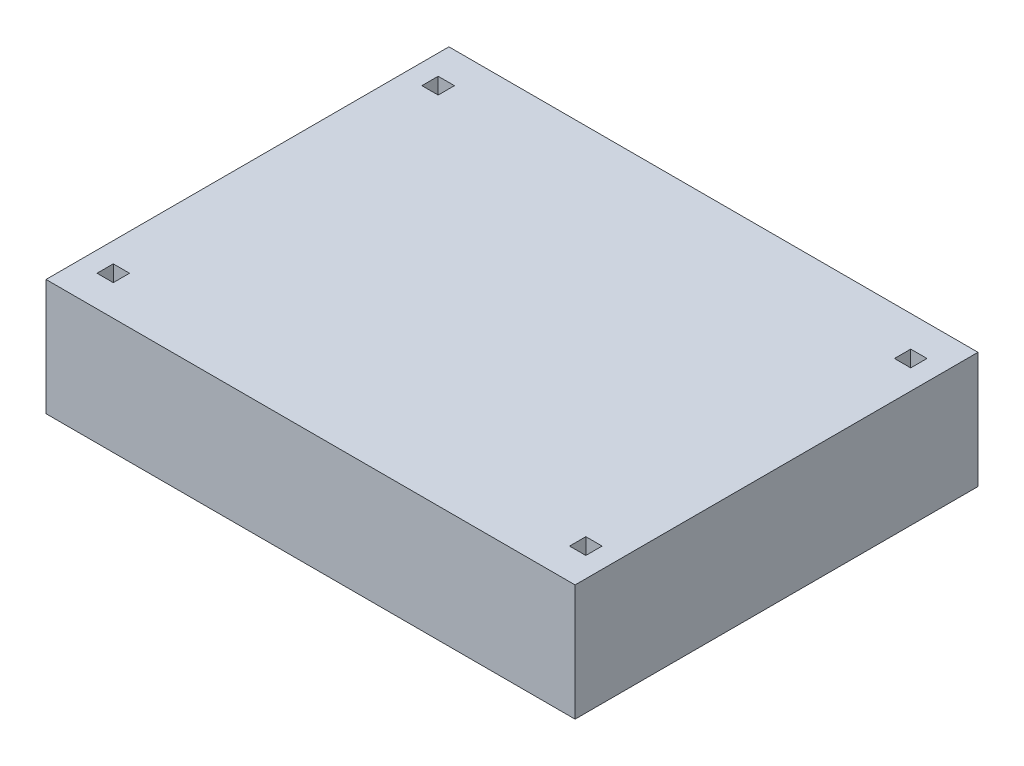
ISO-10303-21;
HEADER;
FILE_DESCRIPTION(('STEP AP214'),'2;1');
FILE_NAME('part.step','',(''),(''),'','','');
FILE_SCHEMA(('AUTOMOTIVE_DESIGN { 1 0 10303 214 1 1 1 1 }'));
ENDSEC;
DATA;
#1=APPLICATION_CONTEXT('core data for automotive mechanical design processes');
#2=APPLICATION_PROTOCOL_DEFINITION('international standard','automotive_design',2000,#1);
#3=PRODUCT_CONTEXT('',#1,'mechanical');
#4=PRODUCT('Part','Part','',(#3));
#5=PRODUCT_RELATED_PRODUCT_CATEGORY('part','',(#4));
#6=PRODUCT_DEFINITION_FORMATION('','',#4);
#7=PRODUCT_DEFINITION_CONTEXT('part definition',#1,'design');
#8=PRODUCT_DEFINITION('design','',#6,#7);
#9=PRODUCT_DEFINITION_SHAPE('','',#8);
#10=(LENGTH_UNIT() NAMED_UNIT(*) SI_UNIT(.MILLI.,.METRE.));
#11=(NAMED_UNIT(*) PLANE_ANGLE_UNIT() SI_UNIT($,.RADIAN.));
#12=(NAMED_UNIT(*) SI_UNIT($,.STERADIAN.) SOLID_ANGLE_UNIT());
#13=UNCERTAINTY_MEASURE_WITH_UNIT(LENGTH_MEASURE(1.E-05),#10,'distance_accuracy_value','');
#14=(GEOMETRIC_REPRESENTATION_CONTEXT(3) GLOBAL_UNCERTAINTY_ASSIGNED_CONTEXT((#13)) GLOBAL_UNIT_ASSIGNED_CONTEXT((#10,
#11,#12)) REPRESENTATION_CONTEXT('',''));
#15=CARTESIAN_POINT('',(0.,0.,0.));
#16=DIRECTION('',(0.,0.,1.));
#17=DIRECTION('',(1.,0.,0.));
#18=AXIS2_PLACEMENT_3D('',#15,#16,#17);
#19=CARTESIAN_POINT('',(-22.75,10.,17.325));
#20=DIRECTION('',(1.,0.,0.));
#21=DIRECTION('',(0.,0.,-1.));
#22=AXIS2_PLACEMENT_3D('',#19,#20,#21);
#23=PLANE('',#22);
#24=DIRECTION('',(0.,0.,1.));
#25=VECTOR('',#24,1.);
#26=CARTESIAN_POINT('',(-22.75,0.,17.325));
#27=LINE('',#26,#25);
#28=CARTESIAN_POINT('',(-22.75,0.,-17.325));
#29=VERTEX_POINT('',#28);
#30=CARTESIAN_POINT('',(-22.75,0.,17.325));
#31=VERTEX_POINT('',#30);
#32=EDGE_CURVE('E294',#29,#31,#27,.T.);
#33=ORIENTED_EDGE('',*,*,#32,.T.);
#34=DIRECTION('',(0.,-1.,0.));
#35=VECTOR('',#34,1.);
#36=CARTESIAN_POINT('',(-22.75,10.,17.325));
#37=LINE('',#36,#35);
#38=CARTESIAN_POINT('',(-22.75,10.,17.325));
#39=VERTEX_POINT('',#38);
#40=EDGE_CURVE('E11',#39,#31,#37,.T.);
#41=ORIENTED_EDGE('',*,*,#40,.F.);
#42=DIRECTION('',(0.,0.,1.));
#43=VECTOR('',#42,1.);
#44=CARTESIAN_POINT('',(-22.75,10.,17.325));
#45=LINE('',#44,#43);
#46=CARTESIAN_POINT('',(-22.75,10.,-17.325));
#47=VERTEX_POINT('',#46);
#48=EDGE_CURVE('E301',#47,#39,#45,.T.);
#49=ORIENTED_EDGE('',*,*,#48,.F.);
#50=DIRECTION('',(0.,-1.,0.));
#51=VECTOR('',#50,1.);
#52=CARTESIAN_POINT('',(-22.75,10.,-17.325));
#53=LINE('',#52,#51);
#54=EDGE_CURVE('E311',#47,#29,#53,.T.);
#55=ORIENTED_EDGE('',*,*,#54,.T.);
#56=EDGE_LOOP('',(#33,#41,#49,#55));
#57=FACE_BOUND('',#56,.T.);
#58=ADVANCED_FACE('F32',(#57),#23,.F.);
#59=CARTESIAN_POINT('',(22.75,10.,17.325));
#60=DIRECTION('',(0.,0.,-1.));
#61=DIRECTION('',(-1.,0.,0.));
#62=AXIS2_PLACEMENT_3D('',#59,#60,#61);
#63=PLANE('',#62);
#64=DIRECTION('',(1.,0.,0.));
#65=VECTOR('',#64,1.);
#66=CARTESIAN_POINT('',(22.75,0.,17.325));
#67=LINE('',#66,#65);
#68=CARTESIAN_POINT('',(22.75,0.,17.325));
#69=VERTEX_POINT('',#68);
#70=EDGE_CURVE('E314',#31,#69,#67,.T.);
#71=ORIENTED_EDGE('',*,*,#70,.T.);
#72=DIRECTION('',(0.,-1.,0.));
#73=VECTOR('',#72,1.);
#74=CARTESIAN_POINT('',(22.75,10.,17.325));
#75=LINE('',#74,#73);
#76=CARTESIAN_POINT('',(22.75,10.,17.325));
#77=VERTEX_POINT('',#76);
#78=EDGE_CURVE('E39',#77,#69,#75,.T.);
#79=ORIENTED_EDGE('',*,*,#78,.F.);
#80=DIRECTION('',(1.,0.,0.));
#81=VECTOR('',#80,1.);
#82=CARTESIAN_POINT('',(22.75,10.,17.325));
#83=LINE('',#82,#81);
#84=EDGE_CURVE('E304',#39,#77,#83,.T.);
#85=ORIENTED_EDGE('',*,*,#84,.F.);
#86=ORIENTED_EDGE('',*,*,#40,.T.);
#87=EDGE_LOOP('',(#71,#79,#85,#86));
#88=FACE_BOUND('',#87,.T.);
#89=ADVANCED_FACE('F344',(#88),#63,.F.);
#90=CARTESIAN_POINT('',(22.75,10.,17.325));
#91=DIRECTION('',(-1.,0.,0.));
#92=DIRECTION('',(0.,0.,1.));
#93=AXIS2_PLACEMENT_3D('',#90,#91,#92);
#94=PLANE('',#93);
#95=DIRECTION('',(0.,0.,-1.));
#96=VECTOR('',#95,1.);
#97=CARTESIAN_POINT('',(22.75,0.,17.325));
#98=LINE('',#97,#96);
#99=CARTESIAN_POINT('',(22.75,0.,-17.325));
#100=VERTEX_POINT('',#99);
#101=EDGE_CURVE('E316',#69,#100,#98,.T.);
#102=ORIENTED_EDGE('',*,*,#101,.T.);
#103=DIRECTION('',(0.,-1.,0.));
#104=VECTOR('',#103,1.);
#105=CARTESIAN_POINT('',(22.75,10.,-17.325));
#106=LINE('',#105,#104);
#107=CARTESIAN_POINT('',(22.75,10.,-17.325));
#108=VERTEX_POINT('',#107);
#109=EDGE_CURVE('E321',#108,#100,#106,.T.);
#110=ORIENTED_EDGE('',*,*,#109,.F.);
#111=DIRECTION('',(0.,0.,-1.));
#112=VECTOR('',#111,1.);
#113=CARTESIAN_POINT('',(22.75,10.,17.325));
#114=LINE('',#113,#112);
#115=EDGE_CURVE('E307',#77,#108,#114,.T.);
#116=ORIENTED_EDGE('',*,*,#115,.F.);
#117=ORIENTED_EDGE('',*,*,#78,.T.);
#118=EDGE_LOOP('',(#102,#110,#116,#117));
#119=FACE_BOUND('',#118,.T.);
#120=ADVANCED_FACE('F328',(#119),#94,.F.);
#121=CARTESIAN_POINT('',(22.75,10.,-17.325));
#122=DIRECTION('',(0.,0.,1.));
#123=DIRECTION('',(1.,0.,0.));
#124=AXIS2_PLACEMENT_3D('',#121,#122,#123);
#125=PLANE('',#124);
#126=DIRECTION('',(-1.,0.,0.));
#127=VECTOR('',#126,1.);
#128=CARTESIAN_POINT('',(22.75,0.,-17.325));
#129=LINE('',#128,#127);
#130=EDGE_CURVE('E305',#100,#29,#129,.T.);
#131=ORIENTED_EDGE('',*,*,#130,.T.);
#132=ORIENTED_EDGE('',*,*,#54,.F.);
#133=DIRECTION('',(-1.,0.,0.));
#134=VECTOR('',#133,1.);
#135=CARTESIAN_POINT('',(22.75,10.,-17.325));
#136=LINE('',#135,#134);
#137=EDGE_CURVE('E309',#108,#47,#136,.T.);
#138=ORIENTED_EDGE('',*,*,#137,.F.);
#139=ORIENTED_EDGE('',*,*,#109,.T.);
#140=EDGE_LOOP('',(#131,#132,#138,#139));
#141=FACE_BOUND('',#140,.T.);
#142=ADVANCED_FACE('F337',(#141),#125,.F.);
#143=CARTESIAN_POINT('',(0.,10.,0.));
#144=DIRECTION('',(0.,1.,0.));
#145=DIRECTION('',(0.,0.,1.));
#146=AXIS2_PLACEMENT_3D('',#143,#144,#145);
#147=PLANE('',#146);
#148=DIRECTION('',(0.,0.,1.));
#149=VECTOR('',#148,1.);
#150=CARTESIAN_POINT('',(19.62,10.,14.67));
#151=LINE('',#150,#149);
#152=CARTESIAN_POINT('',(19.62,10.,13.27));
#153=VERTEX_POINT('',#152);
#154=CARTESIAN_POINT('',(19.62,10.,14.67));
#155=VERTEX_POINT('',#154);
#156=EDGE_CURVE('E46',#153,#155,#151,.T.);
#157=ORIENTED_EDGE('',*,*,#156,.F.);
#158=DIRECTION('',(-1.,0.,0.));
#159=VECTOR('',#158,1.);
#160=CARTESIAN_POINT('',(21.02,10.,13.27));
#161=LINE('',#160,#159);
#162=CARTESIAN_POINT('',(21.02,10.,13.27));
#163=VERTEX_POINT('',#162);
#164=EDGE_CURVE('E188',#163,#153,#161,.T.);
#165=ORIENTED_EDGE('',*,*,#164,.F.);
#166=DIRECTION('',(0.,0.,-1.));
#167=VECTOR('',#166,1.);
#168=CARTESIAN_POINT('',(21.02,10.,14.67));
#169=LINE('',#168,#167);
#170=CARTESIAN_POINT('',(21.02,10.,14.67));
#171=VERTEX_POINT('',#170);
#172=EDGE_CURVE('E191',#171,#163,#169,.T.);
#173=ORIENTED_EDGE('',*,*,#172,.F.);
#174=DIRECTION('',(1.,0.,0.));
#175=VECTOR('',#174,1.);
#176=CARTESIAN_POINT('',(21.02,10.,14.67));
#177=LINE('',#176,#175);
#178=EDGE_CURVE('E197',#155,#171,#177,.T.);
#179=ORIENTED_EDGE('',*,*,#178,.F.);
#180=EDGE_LOOP('',(#157,#165,#173,#179));
#181=FACE_BOUND('',#180,.T.);
#182=DIRECTION('',(0.,0.,-1.));
#183=VECTOR('',#182,1.);
#184=CARTESIAN_POINT('',(-19.62,10.,14.67));
#185=LINE('',#184,#183);
#186=CARTESIAN_POINT('',(-19.62,10.,14.67));
#187=VERTEX_POINT('',#186);
#188=CARTESIAN_POINT('',(-19.62,10.,13.27));
#189=VERTEX_POINT('',#188);
#190=EDGE_CURVE('E54',#187,#189,#185,.T.);
#191=ORIENTED_EDGE('',*,*,#190,.F.);
#192=DIRECTION('',(1.,0.,0.));
#193=VECTOR('',#192,1.);
#194=CARTESIAN_POINT('',(-21.02,10.,14.67));
#195=LINE('',#194,#193);
#196=CARTESIAN_POINT('',(-21.02,10.,14.67));
#197=VERTEX_POINT('',#196);
#198=EDGE_CURVE('E210',#197,#187,#195,.T.);
#199=ORIENTED_EDGE('',*,*,#198,.F.);
#200=DIRECTION('',(0.,0.,1.));
#201=VECTOR('',#200,1.);
#202=CARTESIAN_POINT('',(-21.02,10.,14.67));
#203=LINE('',#202,#201);
#204=CARTESIAN_POINT('',(-21.02,10.,13.27));
#205=VERTEX_POINT('',#204);
#206=EDGE_CURVE('E224',#205,#197,#203,.T.);
#207=ORIENTED_EDGE('',*,*,#206,.F.);
#208=DIRECTION('',(-1.,0.,0.));
#209=VECTOR('',#208,1.);
#210=CARTESIAN_POINT('',(-21.02,10.,13.27));
#211=LINE('',#210,#209);
#212=EDGE_CURVE('E221',#189,#205,#211,.T.);
#213=ORIENTED_EDGE('',*,*,#212,.F.);
#214=EDGE_LOOP('',(#191,#199,#207,#213));
#215=FACE_BOUND('',#214,.T.);
#216=DIRECTION('',(0.,0.,1.));
#217=VECTOR('',#216,1.);
#218=CARTESIAN_POINT('',(19.62,10.,-13.27));
#219=LINE('',#218,#217);
#220=CARTESIAN_POINT('',(19.62,10.,-14.67));
#221=VERTEX_POINT('',#220);
#222=CARTESIAN_POINT('',(19.62,10.,-13.27));
#223=VERTEX_POINT('',#222);
#224=EDGE_CURVE('E231',#221,#223,#219,.T.);
#225=ORIENTED_EDGE('',*,*,#224,.F.);
#226=DIRECTION('',(-1.,0.,0.));
#227=VECTOR('',#226,1.);
#228=CARTESIAN_POINT('',(21.02,10.,-14.67));
#229=LINE('',#228,#227);
#230=CARTESIAN_POINT('',(21.02,10.,-14.67));
#231=VERTEX_POINT('',#230);
#232=EDGE_CURVE('E241',#231,#221,#229,.T.);
#233=ORIENTED_EDGE('',*,*,#232,.F.);
#234=DIRECTION('',(0.,0.,-1.));
#235=VECTOR('',#234,1.);
#236=CARTESIAN_POINT('',(21.02,10.,-13.27));
#237=LINE('',#236,#235);
#238=CARTESIAN_POINT('',(21.02,10.,-13.27));
#239=VERTEX_POINT('',#238);
#240=EDGE_CURVE('E255',#239,#231,#237,.T.);
#241=ORIENTED_EDGE('',*,*,#240,.F.);
#242=DIRECTION('',(1.,0.,0.));
#243=VECTOR('',#242,1.);
#244=CARTESIAN_POINT('',(21.02,10.,-13.27));
#245=LINE('',#244,#243);
#246=EDGE_CURVE('E252',#223,#239,#245,.T.);
#247=ORIENTED_EDGE('',*,*,#246,.F.);
#248=EDGE_LOOP('',(#225,#233,#241,#247));
#249=FACE_BOUND('',#248,.T.);
#250=DIRECTION('',(0.,0.,-1.));
#251=VECTOR('',#250,1.);
#252=CARTESIAN_POINT('',(-19.62,10.,-14.67));
#253=LINE('',#252,#251);
#254=CARTESIAN_POINT('',(-19.62,10.,-13.27));
#255=VERTEX_POINT('',#254);
#256=CARTESIAN_POINT('',(-19.62,10.,-14.67));
#257=VERTEX_POINT('',#256);
#258=EDGE_CURVE('E262',#255,#257,#253,.T.);
#259=ORIENTED_EDGE('',*,*,#258,.F.);
#260=DIRECTION('',(1.,0.,0.));
#261=VECTOR('',#260,1.);
#262=CARTESIAN_POINT('',(-21.02,10.,-13.27));
#263=LINE('',#262,#261);
#264=CARTESIAN_POINT('',(-21.02,10.,-13.27));
#265=VERTEX_POINT('',#264);
#266=EDGE_CURVE('E273',#265,#255,#263,.T.);
#267=ORIENTED_EDGE('',*,*,#266,.F.);
#268=DIRECTION('',(0.,0.,1.));
#269=VECTOR('',#268,1.);
#270=CARTESIAN_POINT('',(-21.02,10.,-14.67));
#271=LINE('',#270,#269);
#272=CARTESIAN_POINT('',(-21.02,10.,-14.67));
#273=VERTEX_POINT('',#272);
#274=EDGE_CURVE('E287',#273,#265,#271,.T.);
#275=ORIENTED_EDGE('',*,*,#274,.F.);
#276=DIRECTION('',(-1.,0.,0.));
#277=VECTOR('',#276,1.);
#278=CARTESIAN_POINT('',(-21.02,10.,-14.67));
#279=LINE('',#278,#277);
#280=EDGE_CURVE('E284',#257,#273,#279,.T.);
#281=ORIENTED_EDGE('',*,*,#280,.F.);
#282=EDGE_LOOP('',(#259,#267,#275,#281));
#283=FACE_BOUND('',#282,.T.);
#284=ORIENTED_EDGE('',*,*,#48,.T.);
#285=ORIENTED_EDGE('',*,*,#84,.T.);
#286=ORIENTED_EDGE('',*,*,#115,.T.);
#287=ORIENTED_EDGE('',*,*,#137,.T.);
#288=EDGE_LOOP('',(#284,#285,#286,#287));
#289=FACE_BOUND('',#288,.T.);
#290=ADVANCED_FACE('F343',(#181,#215,#249,#283,#289),#147,.T.);
#291=CARTESIAN_POINT('',(0.,0.,0.));
#292=DIRECTION('',(0.,1.,0.));
#293=DIRECTION('',(0.,0.,1.));
#294=AXIS2_PLACEMENT_3D('',#291,#292,#293);
#295=PLANE('',#294);
#296=ORIENTED_EDGE('',*,*,#32,.F.);
#297=ORIENTED_EDGE('',*,*,#130,.F.);
#298=ORIENTED_EDGE('',*,*,#101,.F.);
#299=ORIENTED_EDGE('',*,*,#70,.F.);
#300=EDGE_LOOP('',(#296,#297,#298,#299));
#301=FACE_BOUND('',#300,.T.);
#302=ADVANCED_FACE('F334',(#301),#295,.F.);
#303=CARTESIAN_POINT('',(-19.62,3.5,-14.67));
#304=DIRECTION('',(1.,0.,0.));
#305=DIRECTION('',(0.,0.,-1.));
#306=AXIS2_PLACEMENT_3D('',#303,#304,#305);
#307=PLANE('',#306);
#308=ORIENTED_EDGE('',*,*,#258,.T.);
#309=DIRECTION('',(0.,1.,0.));
#310=VECTOR('',#309,1.);
#311=CARTESIAN_POINT('',(-19.62,3.5,-14.67));
#312=LINE('',#311,#310);
#313=CARTESIAN_POINT('',(-19.62,3.5,-14.67));
#314=VERTEX_POINT('',#313);
#315=EDGE_CURVE('E282',#314,#257,#312,.T.);
#316=ORIENTED_EDGE('',*,*,#315,.F.);
#317=DIRECTION('',(0.,0.,-1.));
#318=VECTOR('',#317,1.);
#319=CARTESIAN_POINT('',(-19.62,3.5,-14.67));
#320=LINE('',#319,#318);
#321=CARTESIAN_POINT('',(-19.62,3.5,-13.27));
#322=VERTEX_POINT('',#321);
#323=EDGE_CURVE('E269',#322,#314,#320,.T.);
#324=ORIENTED_EDGE('',*,*,#323,.F.);
#325=DIRECTION('',(0.,1.,0.));
#326=VECTOR('',#325,1.);
#327=CARTESIAN_POINT('',(-19.62,3.5,-13.27));
#328=LINE('',#327,#326);
#329=EDGE_CURVE('E292',#322,#255,#328,.T.);
#330=ORIENTED_EDGE('',*,*,#329,.T.);
#331=EDGE_LOOP('',(#308,#316,#324,#330));
#332=FACE_BOUND('',#331,.T.);
#333=ADVANCED_FACE('F356',(#332),#307,.F.);
#334=CARTESIAN_POINT('',(-21.02,3.5,-13.27));
#335=DIRECTION('',(0.,0.,1.));
#336=DIRECTION('',(1.,0.,0.));
#337=AXIS2_PLACEMENT_3D('',#334,#335,#336);
#338=PLANE('',#337);
#339=ORIENTED_EDGE('',*,*,#266,.T.);
#340=ORIENTED_EDGE('',*,*,#329,.F.);
#341=DIRECTION('',(1.,0.,0.));
#342=VECTOR('',#341,1.);
#343=CARTESIAN_POINT('',(-21.02,3.5,-13.27));
#344=LINE('',#343,#342);
#345=CARTESIAN_POINT('',(-21.02,3.5,-13.27));
#346=VERTEX_POINT('',#345);
#347=EDGE_CURVE('E279',#346,#322,#344,.T.);
#348=ORIENTED_EDGE('',*,*,#347,.F.);
#349=DIRECTION('',(0.,1.,0.));
#350=VECTOR('',#349,1.);
#351=CARTESIAN_POINT('',(-21.02,3.5,-13.27));
#352=LINE('',#351,#350);
#353=EDGE_CURVE('E295',#346,#265,#352,.T.);
#354=ORIENTED_EDGE('',*,*,#353,.T.);
#355=EDGE_LOOP('',(#339,#340,#348,#354));
#356=FACE_BOUND('',#355,.T.);
#357=ADVANCED_FACE('F362',(#356),#338,.F.);
#358=CARTESIAN_POINT('',(-21.02,3.5,-14.67));
#359=DIRECTION('',(-1.,0.,0.));
#360=DIRECTION('',(0.,0.,1.));
#361=AXIS2_PLACEMENT_3D('',#358,#359,#360);
#362=PLANE('',#361);
#363=ORIENTED_EDGE('',*,*,#274,.T.);
#364=ORIENTED_EDGE('',*,*,#353,.F.);
#365=DIRECTION('',(0.,0.,1.));
#366=VECTOR('',#365,1.);
#367=CARTESIAN_POINT('',(-21.02,3.5,-14.67));
#368=LINE('',#367,#366);
#369=CARTESIAN_POINT('',(-21.02,3.5,-14.67));
#370=VERTEX_POINT('',#369);
#371=EDGE_CURVE('E276',#370,#346,#368,.T.);
#372=ORIENTED_EDGE('',*,*,#371,.F.);
#373=DIRECTION('',(0.,1.,0.));
#374=VECTOR('',#373,1.);
#375=CARTESIAN_POINT('',(-21.02,3.5,-14.67));
#376=LINE('',#375,#374);
#377=EDGE_CURVE('E297',#370,#273,#376,.T.);
#378=ORIENTED_EDGE('',*,*,#377,.T.);
#379=EDGE_LOOP('',(#363,#364,#372,#378));
#380=FACE_BOUND('',#379,.T.);
#381=ADVANCED_FACE('F368',(#380),#362,.F.);
#382=CARTESIAN_POINT('',(-21.02,3.5,-14.67));
#383=DIRECTION('',(0.,0.,-1.));
#384=DIRECTION('',(-1.,0.,0.));
#385=AXIS2_PLACEMENT_3D('',#382,#383,#384);
#386=PLANE('',#385);
#387=ORIENTED_EDGE('',*,*,#280,.T.);
#388=ORIENTED_EDGE('',*,*,#377,.F.);
#389=DIRECTION('',(-1.,0.,0.));
#390=VECTOR('',#389,1.);
#391=CARTESIAN_POINT('',(-21.02,3.5,-14.67));
#392=LINE('',#391,#390);
#393=EDGE_CURVE('E272',#314,#370,#392,.T.);
#394=ORIENTED_EDGE('',*,*,#393,.F.);
#395=ORIENTED_EDGE('',*,*,#315,.T.);
#396=EDGE_LOOP('',(#387,#388,#394,#395));
#397=FACE_BOUND('',#396,.T.);
#398=ADVANCED_FACE('F364',(#397),#386,.F.);
#399=CARTESIAN_POINT('',(0.,3.5,0.));
#400=DIRECTION('',(0.,1.,0.));
#401=DIRECTION('',(0.,0.,1.));
#402=AXIS2_PLACEMENT_3D('',#399,#400,#401);
#403=PLANE('',#402);
#404=ORIENTED_EDGE('',*,*,#323,.T.);
#405=ORIENTED_EDGE('',*,*,#393,.T.);
#406=ORIENTED_EDGE('',*,*,#371,.T.);
#407=ORIENTED_EDGE('',*,*,#347,.T.);
#408=EDGE_LOOP('',(#404,#405,#406,#407));
#409=FACE_BOUND('',#408,.T.);
#410=ADVANCED_FACE('F367',(#409),#403,.T.);
#411=CARTESIAN_POINT('',(19.62,3.5,-13.27));
#412=DIRECTION('',(-1.,0.,0.));
#413=DIRECTION('',(0.,0.,1.));
#414=AXIS2_PLACEMENT_3D('',#411,#412,#413);
#415=PLANE('',#414);
#416=ORIENTED_EDGE('',*,*,#224,.T.);
#417=DIRECTION('',(0.,1.,0.));
#418=VECTOR('',#417,1.);
#419=CARTESIAN_POINT('',(19.62,3.5,-13.27));
#420=LINE('',#419,#418);
#421=CARTESIAN_POINT('',(19.62,3.5,-13.27));
#422=VERTEX_POINT('',#421);
#423=EDGE_CURVE('E250',#422,#223,#420,.T.);
#424=ORIENTED_EDGE('',*,*,#423,.F.);
#425=DIRECTION('',(0.,0.,1.));
#426=VECTOR('',#425,1.);
#427=CARTESIAN_POINT('',(19.62,3.5,-13.27));
#428=LINE('',#427,#426);
#429=CARTESIAN_POINT('',(19.62,3.5,-14.67));
#430=VERTEX_POINT('',#429);
#431=EDGE_CURVE('E237',#430,#422,#428,.T.);
#432=ORIENTED_EDGE('',*,*,#431,.F.);
#433=DIRECTION('',(0.,1.,0.));
#434=VECTOR('',#433,1.);
#435=CARTESIAN_POINT('',(19.62,3.5,-14.67));
#436=LINE('',#435,#434);
#437=EDGE_CURVE('E260',#430,#221,#436,.T.);
#438=ORIENTED_EDGE('',*,*,#437,.T.);
#439=EDGE_LOOP('',(#416,#424,#432,#438));
#440=FACE_BOUND('',#439,.T.);
#441=ADVANCED_FACE('F378',(#440),#415,.F.);
#442=CARTESIAN_POINT('',(21.02,3.5,-14.67));
#443=DIRECTION('',(0.,0.,-1.));
#444=DIRECTION('',(-1.,0.,0.));
#445=AXIS2_PLACEMENT_3D('',#442,#443,#444);
#446=PLANE('',#445);
#447=ORIENTED_EDGE('',*,*,#232,.T.);
#448=ORIENTED_EDGE('',*,*,#437,.F.);
#449=DIRECTION('',(-1.,0.,0.));
#450=VECTOR('',#449,1.);
#451=CARTESIAN_POINT('',(21.02,3.5,-14.67));
#452=LINE('',#451,#450);
#453=CARTESIAN_POINT('',(21.02,3.5,-14.67));
#454=VERTEX_POINT('',#453);
#455=EDGE_CURVE('E247',#454,#430,#452,.T.);
#456=ORIENTED_EDGE('',*,*,#455,.F.);
#457=DIRECTION('',(0.,1.,0.));
#458=VECTOR('',#457,1.);
#459=CARTESIAN_POINT('',(21.02,3.5,-14.67));
#460=LINE('',#459,#458);
#461=EDGE_CURVE('E263',#454,#231,#460,.T.);
#462=ORIENTED_EDGE('',*,*,#461,.T.);
#463=EDGE_LOOP('',(#447,#448,#456,#462));
#464=FACE_BOUND('',#463,.T.);
#465=ADVANCED_FACE('F382',(#464),#446,.F.);
#466=CARTESIAN_POINT('',(21.02,3.5,-13.27));
#467=DIRECTION('',(1.,0.,0.));
#468=DIRECTION('',(0.,0.,-1.));
#469=AXIS2_PLACEMENT_3D('',#466,#467,#468);
#470=PLANE('',#469);
#471=ORIENTED_EDGE('',*,*,#240,.T.);
#472=ORIENTED_EDGE('',*,*,#461,.F.);
#473=DIRECTION('',(0.,0.,-1.));
#474=VECTOR('',#473,1.);
#475=CARTESIAN_POINT('',(21.02,3.5,-13.27));
#476=LINE('',#475,#474);
#477=CARTESIAN_POINT('',(21.02,3.5,-13.27));
#478=VERTEX_POINT('',#477);
#479=EDGE_CURVE('E244',#478,#454,#476,.T.);
#480=ORIENTED_EDGE('',*,*,#479,.F.);
#481=DIRECTION('',(0.,1.,0.));
#482=VECTOR('',#481,1.);
#483=CARTESIAN_POINT('',(21.02,3.5,-13.27));
#484=LINE('',#483,#482);
#485=EDGE_CURVE('E265',#478,#239,#484,.T.);
#486=ORIENTED_EDGE('',*,*,#485,.T.);
#487=EDGE_LOOP('',(#471,#472,#480,#486));
#488=FACE_BOUND('',#487,.T.);
#489=ADVANCED_FACE('F388',(#488),#470,.F.);
#490=CARTESIAN_POINT('',(21.02,3.5,-13.27));
#491=DIRECTION('',(0.,0.,1.));
#492=DIRECTION('',(1.,0.,0.));
#493=AXIS2_PLACEMENT_3D('',#490,#491,#492);
#494=PLANE('',#493);
#495=ORIENTED_EDGE('',*,*,#246,.T.);
#496=ORIENTED_EDGE('',*,*,#485,.F.);
#497=DIRECTION('',(1.,0.,0.));
#498=VECTOR('',#497,1.);
#499=CARTESIAN_POINT('',(21.02,3.5,-13.27));
#500=LINE('',#499,#498);
#501=EDGE_CURVE('E240',#422,#478,#500,.T.);
#502=ORIENTED_EDGE('',*,*,#501,.F.);
#503=ORIENTED_EDGE('',*,*,#423,.T.);
#504=EDGE_LOOP('',(#495,#496,#502,#503));
#505=FACE_BOUND('',#504,.T.);
#506=ADVANCED_FACE('F384',(#505),#494,.F.);
#507=CARTESIAN_POINT('',(0.,3.5,0.));
#508=DIRECTION('',(0.,1.,0.));
#509=DIRECTION('',(0.,0.,1.));
#510=AXIS2_PLACEMENT_3D('',#507,#508,#509);
#511=PLANE('',#510);
#512=ORIENTED_EDGE('',*,*,#431,.T.);
#513=ORIENTED_EDGE('',*,*,#501,.T.);
#514=ORIENTED_EDGE('',*,*,#479,.T.);
#515=ORIENTED_EDGE('',*,*,#455,.T.);
#516=EDGE_LOOP('',(#512,#513,#514,#515));
#517=FACE_BOUND('',#516,.T.);
#518=ADVANCED_FACE('F387',(#517),#511,.T.);
#519=CARTESIAN_POINT('',(-19.62,3.5,14.67));
#520=DIRECTION('',(1.,0.,0.));
#521=DIRECTION('',(0.,0.,-1.));
#522=AXIS2_PLACEMENT_3D('',#519,#520,#521);
#523=PLANE('',#522);
#524=ORIENTED_EDGE('',*,*,#190,.T.);
#525=DIRECTION('',(0.,1.,0.));
#526=VECTOR('',#525,1.);
#527=CARTESIAN_POINT('',(-19.62,3.5,13.27));
#528=LINE('',#527,#526);
#529=CARTESIAN_POINT('',(-19.62,3.5,13.27));
#530=VERTEX_POINT('',#529);
#531=EDGE_CURVE('E219',#530,#189,#528,.T.);
#532=ORIENTED_EDGE('',*,*,#531,.F.);
#533=DIRECTION('',(0.,0.,-1.));
#534=VECTOR('',#533,1.);
#535=CARTESIAN_POINT('',(-19.62,3.5,14.67));
#536=LINE('',#535,#534);
#537=CARTESIAN_POINT('',(-19.62,3.5,14.67));
#538=VERTEX_POINT('',#537);
#539=EDGE_CURVE('E206',#538,#530,#536,.T.);
#540=ORIENTED_EDGE('',*,*,#539,.F.);
#541=DIRECTION('',(0.,1.,0.));
#542=VECTOR('',#541,1.);
#543=CARTESIAN_POINT('',(-19.62,3.5,14.67));
#544=LINE('',#543,#542);
#545=EDGE_CURVE('E229',#538,#187,#544,.T.);
#546=ORIENTED_EDGE('',*,*,#545,.T.);
#547=EDGE_LOOP('',(#524,#532,#540,#546));
#548=FACE_BOUND('',#547,.T.);
#549=ADVANCED_FACE('F398',(#548),#523,.F.);
#550=CARTESIAN_POINT('',(-21.02,3.5,14.67));
#551=DIRECTION('',(0.,0.,1.));
#552=DIRECTION('',(1.,0.,0.));
#553=AXIS2_PLACEMENT_3D('',#550,#551,#552);
#554=PLANE('',#553);
#555=ORIENTED_EDGE('',*,*,#198,.T.);
#556=ORIENTED_EDGE('',*,*,#545,.F.);
#557=DIRECTION('',(1.,0.,0.));
#558=VECTOR('',#557,1.);
#559=CARTESIAN_POINT('',(-21.02,3.5,14.67));
#560=LINE('',#559,#558);
#561=CARTESIAN_POINT('',(-21.02,3.5,14.67));
#562=VERTEX_POINT('',#561);
#563=EDGE_CURVE('E216',#562,#538,#560,.T.);
#564=ORIENTED_EDGE('',*,*,#563,.F.);
#565=DIRECTION('',(0.,1.,0.));
#566=VECTOR('',#565,1.);
#567=CARTESIAN_POINT('',(-21.02,3.5,14.67));
#568=LINE('',#567,#566);
#569=EDGE_CURVE('E232',#562,#197,#568,.T.);
#570=ORIENTED_EDGE('',*,*,#569,.T.);
#571=EDGE_LOOP('',(#555,#556,#564,#570));
#572=FACE_BOUND('',#571,.T.);
#573=ADVANCED_FACE('F402',(#572),#554,.F.);
#574=CARTESIAN_POINT('',(-21.02,3.5,14.67));
#575=DIRECTION('',(-1.,0.,0.));
#576=DIRECTION('',(0.,0.,1.));
#577=AXIS2_PLACEMENT_3D('',#574,#575,#576);
#578=PLANE('',#577);
#579=ORIENTED_EDGE('',*,*,#206,.T.);
#580=ORIENTED_EDGE('',*,*,#569,.F.);
#581=DIRECTION('',(0.,0.,1.));
#582=VECTOR('',#581,1.);
#583=CARTESIAN_POINT('',(-21.02,3.5,14.67));
#584=LINE('',#583,#582);
#585=CARTESIAN_POINT('',(-21.02,3.5,13.27));
#586=VERTEX_POINT('',#585);
#587=EDGE_CURVE('E213',#586,#562,#584,.T.);
#588=ORIENTED_EDGE('',*,*,#587,.F.);
#589=DIRECTION('',(0.,1.,0.));
#590=VECTOR('',#589,1.);
#591=CARTESIAN_POINT('',(-21.02,3.5,13.27));
#592=LINE('',#591,#590);
#593=EDGE_CURVE('E234',#586,#205,#592,.T.);
#594=ORIENTED_EDGE('',*,*,#593,.T.);
#595=EDGE_LOOP('',(#579,#580,#588,#594));
#596=FACE_BOUND('',#595,.T.);
#597=ADVANCED_FACE('F407',(#596),#578,.F.);
#598=CARTESIAN_POINT('',(-21.02,3.5,13.27));
#599=DIRECTION('',(0.,0.,-1.));
#600=DIRECTION('',(-1.,0.,0.));
#601=AXIS2_PLACEMENT_3D('',#598,#599,#600);
#602=PLANE('',#601);
#603=ORIENTED_EDGE('',*,*,#212,.T.);
#604=ORIENTED_EDGE('',*,*,#593,.F.);
#605=DIRECTION('',(-1.,0.,0.));
#606=VECTOR('',#605,1.);
#607=CARTESIAN_POINT('',(-21.02,3.5,13.27));
#608=LINE('',#607,#606);
#609=EDGE_CURVE('E209',#530,#586,#608,.T.);
#610=ORIENTED_EDGE('',*,*,#609,.F.);
#611=ORIENTED_EDGE('',*,*,#531,.T.);
#612=EDGE_LOOP('',(#603,#604,#610,#611));
#613=FACE_BOUND('',#612,.T.);
#614=ADVANCED_FACE('F403',(#613),#602,.F.);
#615=CARTESIAN_POINT('',(0.,3.5,0.));
#616=DIRECTION('',(0.,-1.,0.));
#617=DIRECTION('',(0.,0.,-1.));
#618=AXIS2_PLACEMENT_3D('',#615,#616,#617);
#619=PLANE('',#618);
#620=ORIENTED_EDGE('',*,*,#539,.T.);
#621=ORIENTED_EDGE('',*,*,#609,.T.);
#622=ORIENTED_EDGE('',*,*,#587,.T.);
#623=ORIENTED_EDGE('',*,*,#563,.T.);
#624=EDGE_LOOP('',(#620,#621,#622,#623));
#625=FACE_BOUND('',#624,.T.);
#626=ADVANCED_FACE('F406',(#625),#619,.F.);
#627=CARTESIAN_POINT('',(19.62,3.5,14.67));
#628=DIRECTION('',(-1.,0.,0.));
#629=DIRECTION('',(0.,0.,1.));
#630=AXIS2_PLACEMENT_3D('',#627,#628,#629);
#631=PLANE('',#630);
#632=ORIENTED_EDGE('',*,*,#156,.T.);
#633=DIRECTION('',(0.,1.,0.));
#634=VECTOR('',#633,1.);
#635=CARTESIAN_POINT('',(19.62,3.5,14.67));
#636=LINE('',#635,#634);
#637=CARTESIAN_POINT('',(19.62,3.5,14.67));
#638=VERTEX_POINT('',#637);
#639=EDGE_CURVE('E166',#638,#155,#636,.T.);
#640=ORIENTED_EDGE('',*,*,#639,.F.);
#641=DIRECTION('',(0.,0.,1.));
#642=VECTOR('',#641,1.);
#643=CARTESIAN_POINT('',(19.62,3.5,14.67));
#644=LINE('',#643,#642);
#645=CARTESIAN_POINT('',(19.62,3.5,13.27));
#646=VERTEX_POINT('',#645);
#647=EDGE_CURVE('E170',#646,#638,#644,.T.);
#648=ORIENTED_EDGE('',*,*,#647,.F.);
#649=DIRECTION('',(0.,1.,0.));
#650=VECTOR('',#649,1.);
#651=CARTESIAN_POINT('',(19.62,3.5,13.27));
#652=LINE('',#651,#650);
#653=EDGE_CURVE('E201',#646,#153,#652,.T.);
#654=ORIENTED_EDGE('',*,*,#653,.T.);
#655=EDGE_LOOP('',(#632,#640,#648,#654));
#656=FACE_BOUND('',#655,.T.);
#657=ADVANCED_FACE('F168',(#656),#631,.F.);
#658=CARTESIAN_POINT('',(21.02,3.5,13.27));
#659=DIRECTION('',(0.,0.,-1.));
#660=DIRECTION('',(-1.,0.,0.));
#661=AXIS2_PLACEMENT_3D('',#658,#659,#660);
#662=PLANE('',#661);
#663=ORIENTED_EDGE('',*,*,#164,.T.);
#664=ORIENTED_EDGE('',*,*,#653,.F.);
#665=DIRECTION('',(-1.,0.,0.));
#666=VECTOR('',#665,1.);
#667=CARTESIAN_POINT('',(21.02,3.5,13.27));
#668=LINE('',#667,#666);
#669=CARTESIAN_POINT('',(21.02,3.5,13.27));
#670=VERTEX_POINT('',#669);
#671=EDGE_CURVE('E176',#670,#646,#668,.T.);
#672=ORIENTED_EDGE('',*,*,#671,.F.);
#673=DIRECTION('',(0.,1.,0.));
#674=VECTOR('',#673,1.);
#675=CARTESIAN_POINT('',(21.02,3.5,13.27));
#676=LINE('',#675,#674);
#677=EDGE_CURVE('E203',#670,#163,#676,.T.);
#678=ORIENTED_EDGE('',*,*,#677,.T.);
#679=EDGE_LOOP('',(#663,#664,#672,#678));
#680=FACE_BOUND('',#679,.T.);
#681=ADVANCED_FACE('F420',(#680),#662,.F.);
#682=CARTESIAN_POINT('',(21.02,3.5,14.67));
#683=DIRECTION('',(1.,0.,0.));
#684=DIRECTION('',(0.,0.,-1.));
#685=AXIS2_PLACEMENT_3D('',#682,#683,#684);
#686=PLANE('',#685);
#687=ORIENTED_EDGE('',*,*,#172,.T.);
#688=ORIENTED_EDGE('',*,*,#677,.F.);
#689=DIRECTION('',(0.,0.,-1.));
#690=VECTOR('',#689,1.);
#691=CARTESIAN_POINT('',(21.02,3.5,14.67));
#692=LINE('',#691,#690);
#693=CARTESIAN_POINT('',(21.02,3.5,14.67));
#694=VERTEX_POINT('',#693);
#695=EDGE_CURVE('E184',#694,#670,#692,.T.);
#696=ORIENTED_EDGE('',*,*,#695,.F.);
#697=DIRECTION('',(0.,1.,0.));
#698=VECTOR('',#697,1.);
#699=CARTESIAN_POINT('',(21.02,3.5,14.67));
#700=LINE('',#699,#698);
#701=EDGE_CURVE('E175',#694,#171,#700,.T.);
#702=ORIENTED_EDGE('',*,*,#701,.T.);
#703=EDGE_LOOP('',(#687,#688,#696,#702));
#704=FACE_BOUND('',#703,.T.);
#705=ADVANCED_FACE('F423',(#704),#686,.F.);
#706=CARTESIAN_POINT('',(21.02,3.5,14.67));
#707=DIRECTION('',(0.,0.,1.));
#708=DIRECTION('',(1.,0.,0.));
#709=AXIS2_PLACEMENT_3D('',#706,#707,#708);
#710=PLANE('',#709);
#711=ORIENTED_EDGE('',*,*,#178,.T.);
#712=ORIENTED_EDGE('',*,*,#701,.F.);
#713=DIRECTION('',(1.,0.,0.));
#714=VECTOR('',#713,1.);
#715=CARTESIAN_POINT('',(21.02,3.5,14.67));
#716=LINE('',#715,#714);
#717=EDGE_CURVE('E179',#638,#694,#716,.T.);
#718=ORIENTED_EDGE('',*,*,#717,.F.);
#719=ORIENTED_EDGE('',*,*,#639,.T.);
#720=EDGE_LOOP('',(#711,#712,#718,#719));
#721=FACE_BOUND('',#720,.T.);
#722=ADVANCED_FACE('F180',(#721),#710,.F.);
#723=CARTESIAN_POINT('',(0.,3.5,0.));
#724=DIRECTION('',(0.,1.,0.));
#725=DIRECTION('',(0.,0.,1.));
#726=AXIS2_PLACEMENT_3D('',#723,#724,#725);
#727=PLANE('',#726);
#728=ORIENTED_EDGE('',*,*,#647,.T.);
#729=ORIENTED_EDGE('',*,*,#717,.T.);
#730=ORIENTED_EDGE('',*,*,#695,.T.);
#731=ORIENTED_EDGE('',*,*,#671,.T.);
#732=EDGE_LOOP('',(#728,#729,#730,#731));
#733=FACE_BOUND('',#732,.T.);
#734=ADVANCED_FACE('F186',(#733),#727,.T.);
#735=CLOSED_SHELL('',(#58,#89,#120,#142,#290,#302,#333,#357,#381,#398,#410,#441,#465,#489,#506,
#518,#549,#573,#597,#614,#626,#657,#681,#705,#722,#734));
#736=MANIFOLD_SOLID_BREP('B2',#735);
#737=ADVANCED_BREP_SHAPE_REPRESENTATION('',(#18,#736),#14);
#738=SHAPE_DEFINITION_REPRESENTATION(#9,#737);
ENDSEC;
END-ISO-10303-21;
